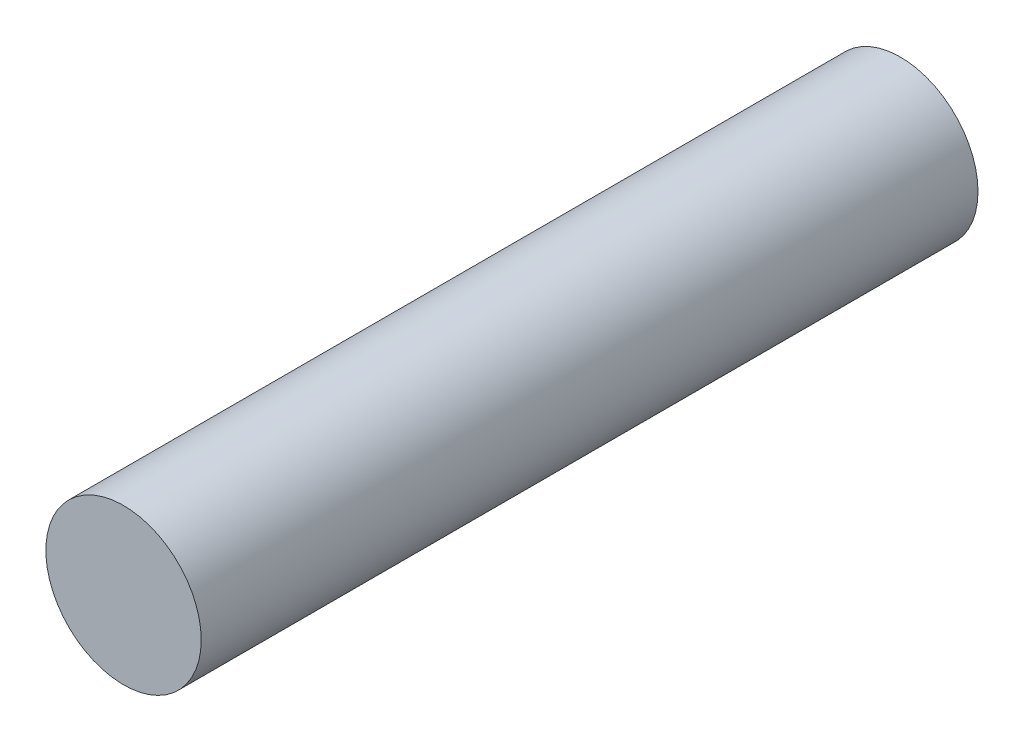
ISO-10303-21;
HEADER;
FILE_DESCRIPTION(('STEP AP214'),'2;1');
FILE_NAME('part.step','',(''),(''),'','','');
FILE_SCHEMA(('AUTOMOTIVE_DESIGN { 1 0 10303 214 1 1 1 1 }'));
ENDSEC;
DATA;
#1=APPLICATION_CONTEXT('core data for automotive mechanical design processes');
#2=APPLICATION_PROTOCOL_DEFINITION('international standard','automotive_design',2000,#1);
#3=PRODUCT_CONTEXT('',#1,'mechanical');
#4=PRODUCT('Part','Part','',(#3));
#5=PRODUCT_RELATED_PRODUCT_CATEGORY('part','',(#4));
#6=PRODUCT_DEFINITION_FORMATION('','',#4);
#7=PRODUCT_DEFINITION_CONTEXT('part definition',#1,'design');
#8=PRODUCT_DEFINITION('design','',#6,#7);
#9=PRODUCT_DEFINITION_SHAPE('','',#8);
#10=(LENGTH_UNIT() NAMED_UNIT(*) SI_UNIT(.MILLI.,.METRE.));
#11=(NAMED_UNIT(*) PLANE_ANGLE_UNIT() SI_UNIT($,.RADIAN.));
#12=(NAMED_UNIT(*) SI_UNIT($,.STERADIAN.) SOLID_ANGLE_UNIT());
#13=UNCERTAINTY_MEASURE_WITH_UNIT(LENGTH_MEASURE(1.E-05),#10,'distance_accuracy_value','');
#14=(GEOMETRIC_REPRESENTATION_CONTEXT(3) GLOBAL_UNCERTAINTY_ASSIGNED_CONTEXT((#13)) GLOBAL_UNIT_ASSIGNED_CONTEXT((#10,
#11,#12)) REPRESENTATION_CONTEXT('',''));
#15=CARTESIAN_POINT('',(0.,0.,0.));
#16=DIRECTION('',(0.,0.,1.));
#17=DIRECTION('',(1.,0.,0.));
#18=AXIS2_PLACEMENT_3D('',#15,#16,#17);
#19=CARTESIAN_POINT('',(0.,0.,200.));
#20=DIRECTION('',(0.,0.,-1.));
#21=DIRECTION('',(-1.,0.,0.));
#22=AXIS2_PLACEMENT_3D('',#19,#20,#21);
#23=CYLINDRICAL_SURFACE('',#22,20.);
#24=CARTESIAN_POINT('',(0.,0.,200.));
#25=DIRECTION('',(0.,0.,1.));
#26=DIRECTION('',(1.,0.,0.));
#27=AXIS2_PLACEMENT_3D('',#24,#25,#26);
#28=CIRCLE('',#27,20.);
#29=CARTESIAN_POINT('',(20.,0.,200.));
#30=VERTEX_POINT('',#29);
#31=EDGE_CURVE('E10',#30,#30,#28,.T.);
#32=ORIENTED_EDGE('',*,*,#31,.F.);
#33=EDGE_LOOP('',(#32));
#34=FACE_BOUND('',#33,.T.);
#35=CARTESIAN_POINT('',(0.,0.,0.));
#36=DIRECTION('',(0.,0.,1.));
#37=DIRECTION('',(1.,0.,0.));
#38=AXIS2_PLACEMENT_3D('',#35,#36,#37);
#39=CIRCLE('',#38,20.);
#40=CARTESIAN_POINT('',(20.,0.,0.));
#41=VERTEX_POINT('',#40);
#42=EDGE_CURVE('E38',#41,#41,#39,.T.);
#43=ORIENTED_EDGE('',*,*,#42,.T.);
#44=EDGE_LOOP('',(#43));
#45=FACE_BOUND('',#44,.T.);
#46=ADVANCED_FACE('F35',(#34,#45),#23,.T.);
#47=CARTESIAN_POINT('',(0.,0.,200.));
#48=DIRECTION('',(0.,0.,1.));
#49=DIRECTION('',(1.,0.,0.));
#50=AXIS2_PLACEMENT_3D('',#47,#48,#49);
#51=PLANE('',#50);
#52=ORIENTED_EDGE('',*,*,#31,.T.);
#53=EDGE_LOOP('',(#52));
#54=FACE_BOUND('',#53,.T.);
#55=ADVANCED_FACE('F52',(#54),#51,.T.);
#56=CARTESIAN_POINT('',(0.,0.,0.));
#57=DIRECTION('',(0.,0.,1.));
#58=DIRECTION('',(1.,0.,0.));
#59=AXIS2_PLACEMENT_3D('',#56,#57,#58);
#60=PLANE('',#59);
#61=ORIENTED_EDGE('',*,*,#42,.F.);
#62=EDGE_LOOP('',(#61));
#63=FACE_BOUND('',#62,.T.);
#64=ADVANCED_FACE('F50',(#63),#60,.F.);
#65=CLOSED_SHELL('',(#46,#55,#64));
#66=MANIFOLD_SOLID_BREP('B2',#65);
#67=ADVANCED_BREP_SHAPE_REPRESENTATION('',(#18,#66),#14);
#68=SHAPE_DEFINITION_REPRESENTATION(#9,#67);
ENDSEC;
END-ISO-10303-21;
